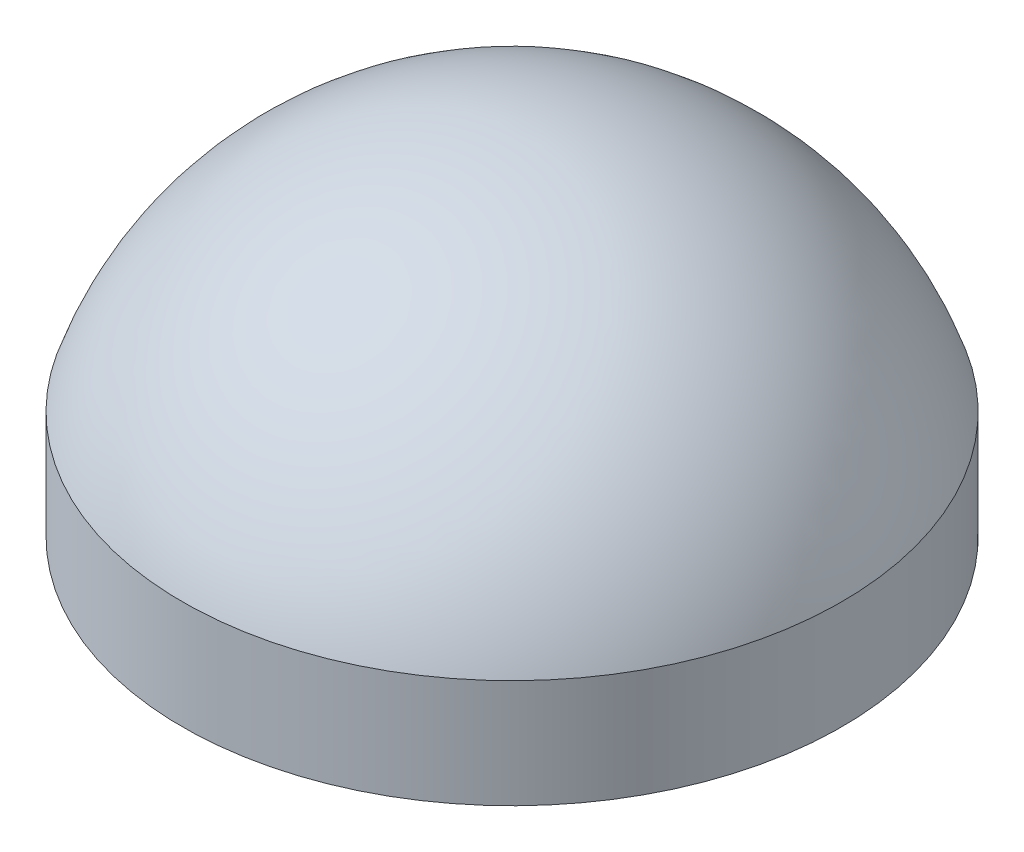
ISO-10303-21;
HEADER;
FILE_DESCRIPTION(('STEP AP214'),'2;1');
FILE_NAME('part.step','',(''),(''),'','','');
FILE_SCHEMA(('AUTOMOTIVE_DESIGN { 1 0 10303 214 1 1 1 1 }'));
ENDSEC;
DATA;
#1=APPLICATION_CONTEXT('core data for automotive mechanical design processes');
#2=APPLICATION_PROTOCOL_DEFINITION('international standard','automotive_design',2000,#1);
#3=PRODUCT_CONTEXT('',#1,'mechanical');
#4=PRODUCT('Part','Part','',(#3));
#5=PRODUCT_RELATED_PRODUCT_CATEGORY('part','',(#4));
#6=PRODUCT_DEFINITION_FORMATION('','',#4);
#7=PRODUCT_DEFINITION_CONTEXT('part definition',#1,'design');
#8=PRODUCT_DEFINITION('design','',#6,#7);
#9=PRODUCT_DEFINITION_SHAPE('','',#8);
#10=(LENGTH_UNIT() NAMED_UNIT(*) SI_UNIT(.MILLI.,.METRE.));
#11=(NAMED_UNIT(*) PLANE_ANGLE_UNIT() SI_UNIT($,.RADIAN.));
#12=(NAMED_UNIT(*) SI_UNIT($,.STERADIAN.) SOLID_ANGLE_UNIT());
#13=UNCERTAINTY_MEASURE_WITH_UNIT(LENGTH_MEASURE(1.E-05),#10,'distance_accuracy_value','');
#14=(GEOMETRIC_REPRESENTATION_CONTEXT(3) GLOBAL_UNCERTAINTY_ASSIGNED_CONTEXT((#13)) GLOBAL_UNIT_ASSIGNED_CONTEXT((#10,
#11,#12)) REPRESENTATION_CONTEXT('',''));
#15=CARTESIAN_POINT('',(0.,0.,0.));
#16=DIRECTION('',(0.,0.,1.));
#17=DIRECTION('',(1.,0.,0.));
#18=AXIS2_PLACEMENT_3D('',#15,#16,#17);
#19=CARTESIAN_POINT('',(0.,0.,0.));
#20=DIRECTION('',(0.,-1.,0.));
#21=DIRECTION('',(0.,0.,-1.));
#22=AXIS2_PLACEMENT_3D('',#19,#20,#21);
#23=PLANE('',#22);
#24=CARTESIAN_POINT('',(0.,0.,0.));
#25=DIRECTION('',(0.,1.,0.));
#26=DIRECTION('',(0.,0.,-1.));
#27=AXIS2_PLACEMENT_3D('',#24,#25,#26);
#28=CIRCLE('',#27,13.);
#29=CARTESIAN_POINT('',(0.,0.,-13.));
#30=VERTEX_POINT('',#29);
#31=EDGE_CURVE('E10',#30,#30,#28,.T.);
#32=ORIENTED_EDGE('',*,*,#31,.T.);
#33=EDGE_LOOP('',(#32));
#34=FACE_BOUND('',#33,.T.);
#35=CARTESIAN_POINT('',(0.,0.,0.));
#36=DIRECTION('',(0.,-1.,0.));
#37=DIRECTION('',(0.,0.,-1.));
#38=AXIS2_PLACEMENT_3D('',#35,#36,#37);
#39=CIRCLE('',#38,19.);
#40=CARTESIAN_POINT('',(0.,0.,-19.));
#41=VERTEX_POINT('',#40);
#42=EDGE_CURVE('E52',#41,#41,#39,.T.);
#43=ORIENTED_EDGE('',*,*,#42,.T.);
#44=EDGE_LOOP('',(#43));
#45=FACE_BOUND('',#44,.T.);
#46=ADVANCED_FACE('F39',(#34,#45),#23,.T.);
#47=CARTESIAN_POINT('',(0.,0.,0.));
#48=DIRECTION('',(-1.,0.,0.));
#49=DIRECTION('',(0.,0.,-1.));
#50=AXIS2_PLACEMENT_3D('',#47,#48,#49);
#51=SPHERICAL_SURFACE('',#50,13.);
#52=CARTESIAN_POINT('',(0.,0.,0.));
#53=DIRECTION('',(0.,1.,0.));
#54=DIRECTION('',(0.,0.,-1.));
#55=AXIS2_PLACEMENT_3D('',#52,#53,#54);
#56=SPHERICAL_SURFACE('',#55,13.);
#57=ORIENTED_EDGE('',*,*,#31,.F.);
#58=EDGE_LOOP('',(#57));
#59=FACE_BOUND('',#58,.T.);
#60=ADVANCED_FACE('F63',(#59),#56,.F.);
#61=CARTESIAN_POINT('',(0.,0.,0.));
#62=DIRECTION('',(0.,-1.,0.));
#63=DIRECTION('',(0.,0.,-1.));
#64=AXIS2_PLACEMENT_3D('',#61,#62,#63);
#65=CYLINDRICAL_SURFACE('',#64,19.);
#66=ORIENTED_EDGE('',*,*,#42,.F.);
#67=EDGE_LOOP('',(#66));
#68=FACE_BOUND('',#67,.T.);
#69=CARTESIAN_POINT('',(0.,6.24499799839839,0.));
#70=DIRECTION('',(0.,-1.,0.));
#71=DIRECTION('',(0.,0.,-1.));
#72=AXIS2_PLACEMENT_3D('',#69,#70,#71);
#73=CIRCLE('',#72,19.);
#74=CARTESIAN_POINT('',(0.,6.24499799839839,-19.));
#75=VERTEX_POINT('',#74);
#76=EDGE_CURVE('E47',#75,#75,#73,.T.);
#77=ORIENTED_EDGE('',*,*,#76,.T.);
#78=EDGE_LOOP('',(#77));
#79=FACE_BOUND('',#78,.T.);
#80=ADVANCED_FACE('F61',(#68,#79),#65,.T.);
#81=CARTESIAN_POINT('',(0.,0.,0.));
#82=DIRECTION('',(-1.,0.,0.));
#83=DIRECTION('',(0.,0.,-1.));
#84=AXIS2_PLACEMENT_3D('',#81,#82,#83);
#85=SPHERICAL_SURFACE('',#84,20.);
#86=CARTESIAN_POINT('',(0.,0.,0.));
#87=DIRECTION('',(0.,-1.,0.));
#88=DIRECTION('',(0.,0.,-1.));
#89=AXIS2_PLACEMENT_3D('',#86,#87,#88);
#90=SPHERICAL_SURFACE('',#89,20.);
#91=ORIENTED_EDGE('',*,*,#76,.F.);
#92=EDGE_LOOP('',(#91));
#93=FACE_BOUND('',#92,.T.);
#94=ADVANCED_FACE('F41',(#93),#90,.T.);
#95=CLOSED_SHELL('',(#46,#60,#80,#94));
#96=MANIFOLD_SOLID_BREP('B2',#95);
#97=ADVANCED_BREP_SHAPE_REPRESENTATION('',(#18,#96),#14);
#98=SHAPE_DEFINITION_REPRESENTATION(#9,#97);
ENDSEC;
END-ISO-10303-21;
